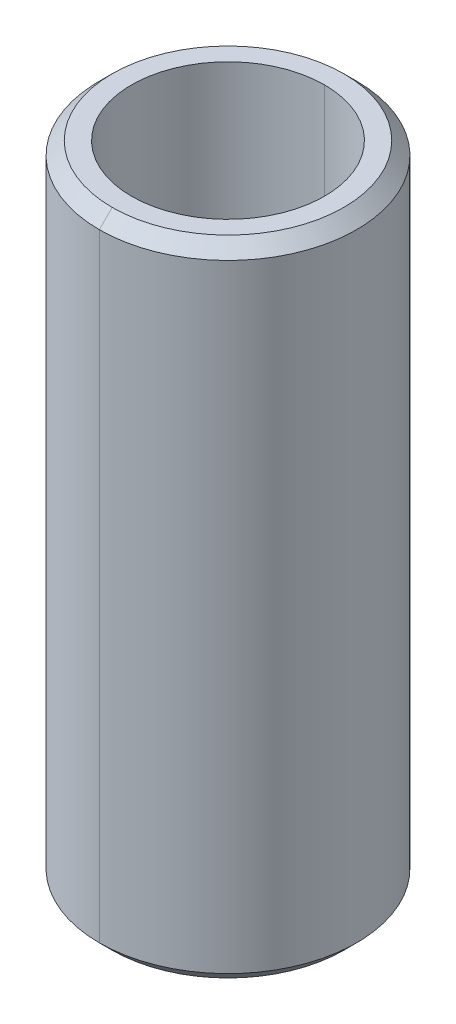
ISO-10303-21;
HEADER;
FILE_DESCRIPTION(('STEP AP214'),'2;1');
FILE_NAME('part.step','',(''),(''),'','','');
FILE_SCHEMA(('AUTOMOTIVE_DESIGN { 1 0 10303 214 1 1 1 1 }'));
ENDSEC;
DATA;
#1=APPLICATION_CONTEXT('core data for automotive mechanical design processes');
#2=APPLICATION_PROTOCOL_DEFINITION('international standard','automotive_design',2000,#1);
#3=PRODUCT_CONTEXT('',#1,'mechanical');
#4=PRODUCT('Part','Part','',(#3));
#5=PRODUCT_RELATED_PRODUCT_CATEGORY('part','',(#4));
#6=PRODUCT_DEFINITION_FORMATION('','',#4);
#7=PRODUCT_DEFINITION_CONTEXT('part definition',#1,'design');
#8=PRODUCT_DEFINITION('design','',#6,#7);
#9=PRODUCT_DEFINITION_SHAPE('','',#8);
#10=(LENGTH_UNIT() NAMED_UNIT(*) SI_UNIT(.MILLI.,.METRE.));
#11=(NAMED_UNIT(*) PLANE_ANGLE_UNIT() SI_UNIT($,.RADIAN.));
#12=(NAMED_UNIT(*) SI_UNIT($,.STERADIAN.) SOLID_ANGLE_UNIT());
#13=UNCERTAINTY_MEASURE_WITH_UNIT(LENGTH_MEASURE(1.E-05),#10,'distance_accuracy_value','');
#14=(GEOMETRIC_REPRESENTATION_CONTEXT(3) GLOBAL_UNCERTAINTY_ASSIGNED_CONTEXT((#13)) GLOBAL_UNIT_ASSIGNED_CONTEXT((#10,
#11,#12)) REPRESENTATION_CONTEXT('',''));
#15=CARTESIAN_POINT('',(0.,0.,0.));
#16=DIRECTION('',(0.,0.,1.));
#17=DIRECTION('',(1.,0.,0.));
#18=AXIS2_PLACEMENT_3D('',#15,#16,#17);
#19=CARTESIAN_POINT('',(0.,20.,0.));
#20=DIRECTION('',(0.,-1.,0.));
#21=DIRECTION('',(0.,0.,-1.));
#22=AXIS2_PLACEMENT_3D('',#19,#20,#21);
#23=CONICAL_SURFACE('',#22,3.6,0.785398163397448);
#24=DIRECTION('',(0.,-0.707106781186548,0.707106781186548));
#25=VECTOR('',#24,1.);
#26=CARTESIAN_POINT('',(0.,20.,3.6));
#27=LINE('',#26,#25);
#28=CARTESIAN_POINT('',(0.,20.,3.6));
#29=VERTEX_POINT('',#28);
#30=CARTESIAN_POINT('',(0.,19.6,4.));
#31=VERTEX_POINT('',#30);
#32=EDGE_CURVE('E99',#29,#31,#27,.T.);
#33=ORIENTED_EDGE('',*,*,#32,.F.);
#34=CARTESIAN_POINT('',(0.,20.,0.));
#35=DIRECTION('',(0.,1.,0.));
#36=DIRECTION('',(0.,0.,1.));
#37=AXIS2_PLACEMENT_3D('',#34,#35,#36);
#38=CIRCLE('',#37,3.6);
#39=CARTESIAN_POINT('',(0.,20.,-3.6));
#40=VERTEX_POINT('',#39);
#41=EDGE_CURVE('E87',#40,#29,#38,.T.);
#42=ORIENTED_EDGE('',*,*,#41,.F.);
#43=DIRECTION('',(0.,-0.707106781186548,-0.707106781186548));
#44=VECTOR('',#43,1.);
#45=CARTESIAN_POINT('',(0.,20.,-3.6));
#46=LINE('',#45,#44);
#47=CARTESIAN_POINT('',(0.,19.6,-4.));
#48=VERTEX_POINT('',#47);
#49=EDGE_CURVE('E107',#40,#48,#46,.T.);
#50=ORIENTED_EDGE('',*,*,#49,.T.);
#51=CARTESIAN_POINT('',(0.,19.6,0.));
#52=DIRECTION('',(0.,-1.,0.));
#53=DIRECTION('',(0.,0.,1.));
#54=AXIS2_PLACEMENT_3D('',#51,#52,#53);
#55=CIRCLE('',#54,4.);
#56=EDGE_CURVE('E25',#31,#48,#55,.T.);
#57=ORIENTED_EDGE('',*,*,#56,.F.);
#58=EDGE_LOOP('',(#33,#42,#50,#57));
#59=FACE_BOUND('',#58,.T.);
#60=ADVANCED_FACE('F17',(#59),#23,.T.);
#61=CARTESIAN_POINT('',(0.,0.4,0.));
#62=DIRECTION('',(0.,1.,0.));
#63=DIRECTION('',(0.,0.,1.));
#64=AXIS2_PLACEMENT_3D('',#61,#62,#63);
#65=CONICAL_SURFACE('',#64,4.,0.78539816339745);
#66=DIRECTION('',(0.,0.707106781186546,-0.707106781186549));
#67=VECTOR('',#66,1.);
#68=CARTESIAN_POINT('',(0.,0.4,-4.));
#69=LINE('',#68,#67);
#70=CARTESIAN_POINT('',(0.,0.,-3.6));
#71=VERTEX_POINT('',#70);
#72=CARTESIAN_POINT('',(0.,0.4,-4.));
#73=VERTEX_POINT('',#72);
#74=EDGE_CURVE('E133',#71,#73,#69,.T.);
#75=ORIENTED_EDGE('',*,*,#74,.F.);
#76=CARTESIAN_POINT('',(0.,0.,0.));
#77=DIRECTION('',(0.,-1.,0.));
#78=DIRECTION('',(0.,0.,1.));
#79=AXIS2_PLACEMENT_3D('',#76,#77,#78);
#80=CIRCLE('',#79,3.6);
#81=CARTESIAN_POINT('',(0.,0.,3.6));
#82=VERTEX_POINT('',#81);
#83=EDGE_CURVE('E158',#82,#71,#80,.T.);
#84=ORIENTED_EDGE('',*,*,#83,.F.);
#85=DIRECTION('',(0.,0.707106781186546,0.707106781186549));
#86=VECTOR('',#85,1.);
#87=CARTESIAN_POINT('',(0.,0.4,4.));
#88=LINE('',#87,#86);
#89=CARTESIAN_POINT('',(0.,0.4,4.));
#90=VERTEX_POINT('',#89);
#91=EDGE_CURVE('E122',#82,#90,#88,.T.);
#92=ORIENTED_EDGE('',*,*,#91,.T.);
#93=CARTESIAN_POINT('',(0.,0.4,0.));
#94=DIRECTION('',(0.,1.,0.));
#95=DIRECTION('',(0.,0.,1.));
#96=AXIS2_PLACEMENT_3D('',#93,#94,#95);
#97=CIRCLE('',#96,4.);
#98=EDGE_CURVE('E11',#73,#90,#97,.T.);
#99=ORIENTED_EDGE('',*,*,#98,.F.);
#100=EDGE_LOOP('',(#75,#84,#92,#99));
#101=FACE_BOUND('',#100,.T.);
#102=ADVANCED_FACE('F176',(#101),#65,.T.);
#103=CARTESIAN_POINT('',(0.,20.,0.));
#104=DIRECTION('',(0.,-1.,0.));
#105=DIRECTION('',(0.,0.,-1.));
#106=AXIS2_PLACEMENT_3D('',#103,#104,#105);
#107=CYLINDRICAL_SURFACE('',#106,3.);
#108=DIRECTION('',(0.,-1.,0.));
#109=VECTOR('',#108,1.);
#110=CARTESIAN_POINT('',(0.,20.,3.));
#111=LINE('',#110,#109);
#112=CARTESIAN_POINT('',(0.,20.,3.));
#113=VERTEX_POINT('',#112);
#114=CARTESIAN_POINT('',(0.,0.,3.));
#115=VERTEX_POINT('',#114);
#116=EDGE_CURVE('E150',#113,#115,#111,.T.);
#117=ORIENTED_EDGE('',*,*,#116,.F.);
#118=CARTESIAN_POINT('',(0.,20.,0.));
#119=DIRECTION('',(0.,1.,0.));
#120=DIRECTION('',(0.,0.,1.));
#121=AXIS2_PLACEMENT_3D('',#118,#119,#120);
#122=CIRCLE('',#121,3.);
#123=CARTESIAN_POINT('',(0.,20.,-3.));
#124=VERTEX_POINT('',#123);
#125=EDGE_CURVE('E96',#113,#124,#122,.T.);
#126=ORIENTED_EDGE('',*,*,#125,.T.);
#127=DIRECTION('',(0.,-1.,0.));
#128=VECTOR('',#127,1.);
#129=CARTESIAN_POINT('',(0.,20.,-3.));
#130=LINE('',#129,#128);
#131=CARTESIAN_POINT('',(0.,0.,-3.));
#132=VERTEX_POINT('',#131);
#133=EDGE_CURVE('E117',#124,#132,#130,.T.);
#134=ORIENTED_EDGE('',*,*,#133,.T.);
#135=CARTESIAN_POINT('',(0.,0.,0.));
#136=DIRECTION('',(0.,1.,0.));
#137=DIRECTION('',(0.,0.,1.));
#138=AXIS2_PLACEMENT_3D('',#135,#136,#137);
#139=CIRCLE('',#138,3.);
#140=EDGE_CURVE('E40',#115,#132,#139,.T.);
#141=ORIENTED_EDGE('',*,*,#140,.F.);
#142=EDGE_LOOP('',(#117,#126,#134,#141));
#143=FACE_BOUND('',#142,.T.);
#144=ADVANCED_FACE('F189',(#143),#107,.F.);
#145=CARTESIAN_POINT('',(0.,20.,0.));
#146=DIRECTION('',(0.,-1.,0.));
#147=DIRECTION('',(0.,0.,-1.));
#148=AXIS2_PLACEMENT_3D('',#145,#146,#147);
#149=CYLINDRICAL_SURFACE('',#148,4.);
#150=DIRECTION('',(0.,-1.,0.));
#151=VECTOR('',#150,1.);
#152=CARTESIAN_POINT('',(0.,20.,4.));
#153=LINE('',#152,#151);
#154=EDGE_CURVE('E113',#31,#90,#153,.T.);
#155=ORIENTED_EDGE('',*,*,#154,.F.);
#156=ORIENTED_EDGE('',*,*,#56,.T.);
#157=DIRECTION('',(0.,-1.,0.));
#158=VECTOR('',#157,1.);
#159=CARTESIAN_POINT('',(0.,20.,-4.));
#160=LINE('',#159,#158);
#161=EDGE_CURVE('E100',#48,#73,#160,.T.);
#162=ORIENTED_EDGE('',*,*,#161,.T.);
#163=ORIENTED_EDGE('',*,*,#98,.T.);
#164=EDGE_LOOP('',(#155,#156,#162,#163));
#165=FACE_BOUND('',#164,.T.);
#166=ADVANCED_FACE('F170',(#165),#149,.T.);
#167=CARTESIAN_POINT('',(0.,0.,0.));
#168=DIRECTION('',(0.,1.,0.));
#169=DIRECTION('',(1.,0.,0.));
#170=AXIS2_PLACEMENT_3D('',#167,#168,#169);
#171=PLANE('',#170);
#172=CARTESIAN_POINT('',(0.,0.,0.));
#173=DIRECTION('',(0.,1.,0.));
#174=DIRECTION('',(0.,0.,1.));
#175=AXIS2_PLACEMENT_3D('',#172,#173,#174);
#176=CIRCLE('',#175,3.);
#177=EDGE_CURVE('E141',#132,#115,#176,.T.);
#178=ORIENTED_EDGE('',*,*,#177,.T.);
#179=ORIENTED_EDGE('',*,*,#140,.T.);
#180=EDGE_LOOP('',(#178,#179));
#181=FACE_BOUND('',#180,.T.);
#182=ORIENTED_EDGE('',*,*,#83,.T.);
#183=CARTESIAN_POINT('',(0.,0.,0.));
#184=DIRECTION('',(0.,-1.,0.));
#185=DIRECTION('',(0.,0.,1.));
#186=AXIS2_PLACEMENT_3D('',#183,#184,#185);
#187=CIRCLE('',#186,3.6);
#188=EDGE_CURVE('E123',#71,#82,#187,.T.);
#189=ORIENTED_EDGE('',*,*,#188,.T.);
#190=EDGE_LOOP('',(#182,#189));
#191=FACE_BOUND('',#190,.T.);
#192=ADVANCED_FACE('F178',(#181,#191),#171,.F.);
#193=CARTESIAN_POINT('',(0.,20.,0.));
#194=DIRECTION('',(0.,1.,0.));
#195=DIRECTION('',(1.,0.,0.));
#196=AXIS2_PLACEMENT_3D('',#193,#194,#195);
#197=PLANE('',#196);
#198=CARTESIAN_POINT('',(0.,20.,0.));
#199=DIRECTION('',(0.,1.,0.));
#200=DIRECTION('',(0.,0.,1.));
#201=AXIS2_PLACEMENT_3D('',#198,#199,#200);
#202=CIRCLE('',#201,3.);
#203=EDGE_CURVE('E127',#124,#113,#202,.T.);
#204=ORIENTED_EDGE('',*,*,#203,.F.);
#205=ORIENTED_EDGE('',*,*,#125,.F.);
#206=EDGE_LOOP('',(#204,#205));
#207=FACE_BOUND('',#206,.T.);
#208=ORIENTED_EDGE('',*,*,#41,.T.);
#209=CARTESIAN_POINT('',(0.,20.,0.));
#210=DIRECTION('',(0.,1.,0.));
#211=DIRECTION('',(0.,0.,1.));
#212=AXIS2_PLACEMENT_3D('',#209,#210,#211);
#213=CIRCLE('',#212,3.6);
#214=EDGE_CURVE('E93',#29,#40,#213,.T.);
#215=ORIENTED_EDGE('',*,*,#214,.T.);
#216=EDGE_LOOP('',(#208,#215));
#217=FACE_BOUND('',#216,.T.);
#218=ADVANCED_FACE('F90',(#207,#217),#197,.T.);
#219=CARTESIAN_POINT('',(0.,20.,0.));
#220=DIRECTION('',(0.,-1.,0.));
#221=DIRECTION('',(0.,0.,-1.));
#222=AXIS2_PLACEMENT_3D('',#219,#220,#221);
#223=CYLINDRICAL_SURFACE('',#222,4.);
#224=CARTESIAN_POINT('',(0.,19.6,0.));
#225=DIRECTION('',(0.,-1.,0.));
#226=DIRECTION('',(0.,0.,1.));
#227=AXIS2_PLACEMENT_3D('',#224,#225,#226);
#228=CIRCLE('',#227,4.);
#229=EDGE_CURVE('E104',#48,#31,#228,.T.);
#230=ORIENTED_EDGE('',*,*,#229,.T.);
#231=ORIENTED_EDGE('',*,*,#154,.T.);
#232=CARTESIAN_POINT('',(0.,0.4,0.));
#233=DIRECTION('',(0.,1.,0.));
#234=DIRECTION('',(0.,0.,1.));
#235=AXIS2_PLACEMENT_3D('',#232,#233,#234);
#236=CIRCLE('',#235,4.);
#237=EDGE_CURVE('E129',#90,#73,#236,.T.);
#238=ORIENTED_EDGE('',*,*,#237,.T.);
#239=ORIENTED_EDGE('',*,*,#161,.F.);
#240=EDGE_LOOP('',(#230,#231,#238,#239));
#241=FACE_BOUND('',#240,.T.);
#242=ADVANCED_FACE('F166',(#241),#223,.T.);
#243=CARTESIAN_POINT('',(0.,20.,0.));
#244=DIRECTION('',(0.,-1.,0.));
#245=DIRECTION('',(0.,0.,-1.));
#246=AXIS2_PLACEMENT_3D('',#243,#244,#245);
#247=CYLINDRICAL_SURFACE('',#246,3.);
#248=ORIENTED_EDGE('',*,*,#203,.T.);
#249=ORIENTED_EDGE('',*,*,#116,.T.);
#250=ORIENTED_EDGE('',*,*,#177,.F.);
#251=ORIENTED_EDGE('',*,*,#133,.F.);
#252=EDGE_LOOP('',(#248,#249,#250,#251));
#253=FACE_BOUND('',#252,.T.);
#254=ADVANCED_FACE('F202',(#253),#247,.F.);
#255=CARTESIAN_POINT('',(0.,0.4,0.));
#256=DIRECTION('',(0.,1.,0.));
#257=DIRECTION('',(0.,0.,1.));
#258=AXIS2_PLACEMENT_3D('',#255,#256,#257);
#259=CONICAL_SURFACE('',#258,4.,0.78539816339745);
#260=ORIENTED_EDGE('',*,*,#188,.F.);
#261=ORIENTED_EDGE('',*,*,#74,.T.);
#262=ORIENTED_EDGE('',*,*,#237,.F.);
#263=ORIENTED_EDGE('',*,*,#91,.F.);
#264=EDGE_LOOP('',(#260,#261,#262,#263));
#265=FACE_BOUND('',#264,.T.);
#266=ADVANCED_FACE('F175',(#265),#259,.T.);
#267=CARTESIAN_POINT('',(0.,20.,0.));
#268=DIRECTION('',(0.,-1.,0.));
#269=DIRECTION('',(0.,0.,-1.));
#270=AXIS2_PLACEMENT_3D('',#267,#268,#269);
#271=CONICAL_SURFACE('',#270,3.6,0.785398163397448);
#272=ORIENTED_EDGE('',*,*,#214,.F.);
#273=ORIENTED_EDGE('',*,*,#32,.T.);
#274=ORIENTED_EDGE('',*,*,#229,.F.);
#275=ORIENTED_EDGE('',*,*,#49,.F.);
#276=EDGE_LOOP('',(#272,#273,#274,#275));
#277=FACE_BOUND('',#276,.T.);
#278=ADVANCED_FACE('F110',(#277),#271,.T.);
#279=CLOSED_SHELL('',(#60,#102,#144,#166,#192,#218,#242,#254,#266,#278));
#280=MANIFOLD_SOLID_BREP('B1',#279);
#281=ADVANCED_BREP_SHAPE_REPRESENTATION('',(#18,#280),#14);
#282=SHAPE_DEFINITION_REPRESENTATION(#9,#281);
ENDSEC;
END-ISO-10303-21;
